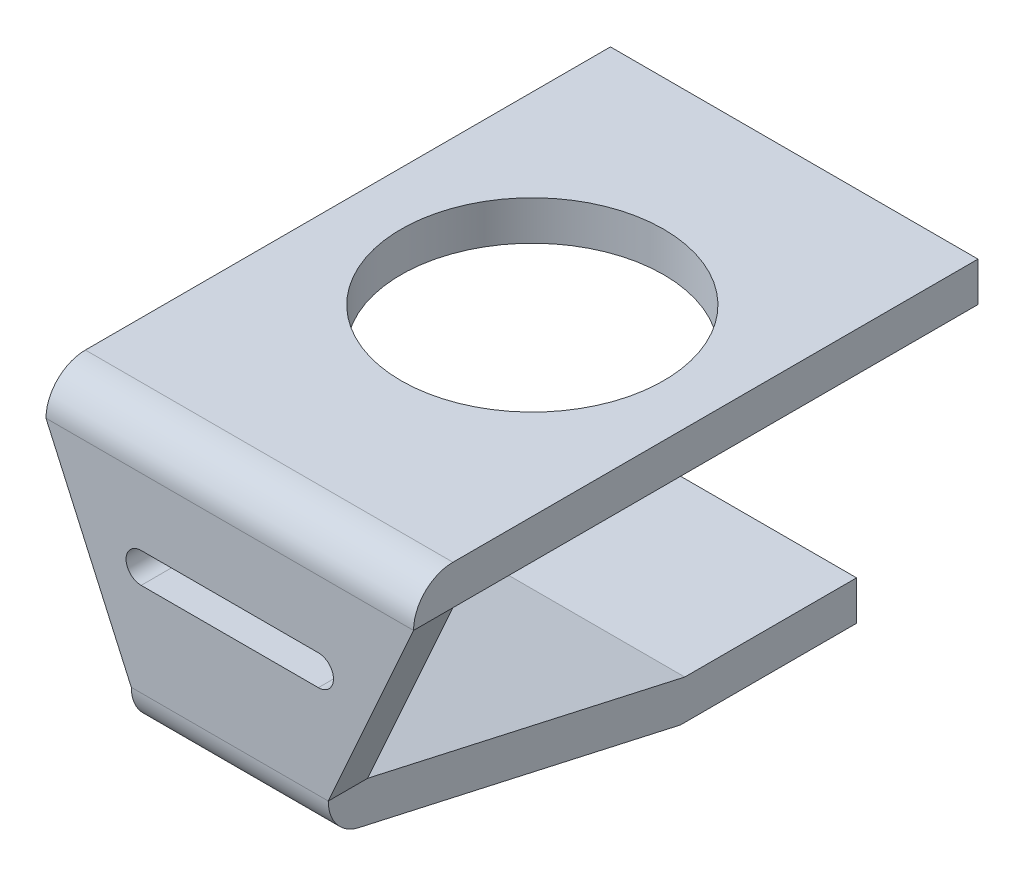
ISO-10303-21;
HEADER;
FILE_DESCRIPTION(('STEP AP214'),'2;1');
FILE_NAME('part.step','',(''),(''),'','','');
FILE_SCHEMA(('AUTOMOTIVE_DESIGN { 1 0 10303 214 1 1 1 1 }'));
ENDSEC;
DATA;
#1=APPLICATION_CONTEXT('core data for automotive mechanical design processes');
#2=APPLICATION_PROTOCOL_DEFINITION('international standard','automotive_design',2000,#1);
#3=PRODUCT_CONTEXT('',#1,'mechanical');
#4=PRODUCT('Part','Part','',(#3));
#5=PRODUCT_RELATED_PRODUCT_CATEGORY('part','',(#4));
#6=PRODUCT_DEFINITION_FORMATION('','',#4);
#7=PRODUCT_DEFINITION_CONTEXT('part definition',#1,'design');
#8=PRODUCT_DEFINITION('design','',#6,#7);
#9=PRODUCT_DEFINITION_SHAPE('','',#8);
#10=(LENGTH_UNIT() NAMED_UNIT(*) SI_UNIT(.MILLI.,.METRE.));
#11=(NAMED_UNIT(*) PLANE_ANGLE_UNIT() SI_UNIT($,.RADIAN.));
#12=(NAMED_UNIT(*) SI_UNIT($,.STERADIAN.) SOLID_ANGLE_UNIT());
#13=UNCERTAINTY_MEASURE_WITH_UNIT(LENGTH_MEASURE(1.E-05),#10,'distance_accuracy_value','');
#14=(GEOMETRIC_REPRESENTATION_CONTEXT(3) GLOBAL_UNCERTAINTY_ASSIGNED_CONTEXT((#13)) GLOBAL_UNIT_ASSIGNED_CONTEXT((#10,
#11,#12)) REPRESENTATION_CONTEXT('',''));
#15=CARTESIAN_POINT('',(0.,0.,0.));
#16=DIRECTION('',(0.,0.,1.));
#17=DIRECTION('',(1.,0.,0.));
#18=AXIS2_PLACEMENT_3D('',#15,#16,#17);
#19=CARTESIAN_POINT('',(-2.8,-0.15,2.));
#20=DIRECTION('',(0.,0.,-1.));
#21=DIRECTION('',(-1.,0.,0.));
#22=AXIS2_PLACEMENT_3D('',#19,#20,#21);
#23=PLANE('',#22);
#24=CARTESIAN_POINT('',(-2.075,-0.775,2.));
#25=DIRECTION('',(0.,0.,-1.));
#26=DIRECTION('',(-1.,0.,0.));
#27=AXIS2_PLACEMENT_3D('',#24,#25,#26);
#28=CIRCLE('',#27,0.115110676224058);
#29=CARTESIAN_POINT('',(-2.075,-0.890110676224058,2.));
#30=VERTEX_POINT('',#29);
#31=CARTESIAN_POINT('',(-2.075,-0.659889323775942,2.));
#32=VERTEX_POINT('',#31);
#33=EDGE_CURVE('E192',#30,#32,#28,.T.);
#34=ORIENTED_EDGE('',*,*,#33,.F.);
#35=DIRECTION('',(-1.,0.,0.));
#36=VECTOR('',#35,1.);
#37=CARTESIAN_POINT('',(-2.8,-0.890110676224058,2.));
#38=LINE('',#37,#36);
#39=CARTESIAN_POINT('',(-0.724999999999999,-0.890110676224058,2.));
#40=VERTEX_POINT('',#39);
#41=EDGE_CURVE('E185',#40,#30,#38,.T.);
#42=ORIENTED_EDGE('',*,*,#41,.F.);
#43=CARTESIAN_POINT('',(-0.724999999999999,-0.775,2.));
#44=DIRECTION('',(0.,0.,-1.));
#45=DIRECTION('',(-1.,0.,0.));
#46=AXIS2_PLACEMENT_3D('',#43,#44,#45);
#47=CIRCLE('',#46,0.115110676224058);
#48=CARTESIAN_POINT('',(-0.724999999999999,-0.659889323775942,2.));
#49=VERTEX_POINT('',#48);
#50=EDGE_CURVE('E165',#49,#40,#47,.T.);
#51=ORIENTED_EDGE('',*,*,#50,.F.);
#52=DIRECTION('',(1.,0.,0.));
#53=VECTOR('',#52,1.);
#54=CARTESIAN_POINT('',(-2.8,-0.659889323775942,2.));
#55=LINE('',#54,#53);
#56=EDGE_CURVE('E190',#32,#49,#55,.T.);
#57=ORIENTED_EDGE('',*,*,#56,.F.);
#58=EDGE_LOOP('',(#34,#42,#51,#57));
#59=FACE_BOUND('',#58,.T.);
#60=DIRECTION('',(0.408860890126183,0.912596719545509,0.));
#61=VECTOR('',#60,1.);
#62=CARTESIAN_POINT('',(-0.46806823692937,-1.19475029982291,2.));
#63=LINE('',#62,#61);
#64=CARTESIAN_POINT('',(-0.649795639817083,-1.60037440262147,2.));
#65=VERTEX_POINT('',#64);
#66=CARTESIAN_POINT('',(0.,-0.15,2.));
#67=VERTEX_POINT('',#66);
#68=EDGE_CURVE('E210',#65,#67,#63,.T.);
#69=ORIENTED_EDGE('',*,*,#68,.F.);
#70=DIRECTION('',(1.,0.,0.));
#71=VECTOR('',#70,1.);
#72=CARTESIAN_POINT('',(-2.8,-1.60037440262147,2.));
#73=LINE('',#72,#71);
#74=CARTESIAN_POINT('',(-2.15020436018292,-1.60037440262147,2.));
#75=VERTEX_POINT('',#74);
#76=EDGE_CURVE('E273',#75,#65,#73,.T.);
#77=ORIENTED_EDGE('',*,*,#76,.F.);
#78=DIRECTION('',(-0.408860890126184,0.912596719545509,0.));
#79=VECTOR('',#78,1.);
#80=CARTESIAN_POINT('',(-2.8,-0.15,2.));
#81=LINE('',#80,#79);
#82=CARTESIAN_POINT('',(-2.8,-0.15,2.));
#83=VERTEX_POINT('',#82);
#84=EDGE_CURVE('E215',#75,#83,#81,.T.);
#85=ORIENTED_EDGE('',*,*,#84,.T.);
#86=DIRECTION('',(1.,0.,0.));
#87=VECTOR('',#86,1.);
#88=CARTESIAN_POINT('',(-2.8,-0.15,2.));
#89=LINE('',#88,#87);
#90=EDGE_CURVE('E270',#83,#67,#89,.T.);
#91=ORIENTED_EDGE('',*,*,#90,.T.);
#92=EDGE_LOOP('',(#69,#77,#85,#91));
#93=FACE_BOUND('',#92,.T.);
#94=ADVANCED_FACE('F35',(#59,#93),#23,.T.);
#95=CARTESIAN_POINT('',(-2.8,-1.60037440262147,2.));
#96=DIRECTION('',(0.,0.975932649259894,-0.218072153445976));
#97=DIRECTION('',(0.,0.218072153445976,0.975932649259894));
#98=AXIS2_PLACEMENT_3D('',#95,#96,#97);
#99=PLANE('',#98);
#100=DIRECTION('',(0.,0.218072153445976,0.975932649259894));
#101=VECTOR('',#100,1.);
#102=CARTESIAN_POINT('',(-0.650000000000001,-1.60037440262147,2.));
#103=LINE('',#102,#101);
#104=CARTESIAN_POINT('',(-0.65,-2.14029609795219,-0.416297551936367));
#105=VERTEX_POINT('',#104);
#106=CARTESIAN_POINT('',(-0.650000000000001,-1.60083054415283,1.99795864164174));
#107=VERTEX_POINT('',#106);
#108=EDGE_CURVE('E226',#105,#107,#103,.T.);
#109=ORIENTED_EDGE('',*,*,#108,.F.);
#110=DIRECTION('',(1.,0.,0.));
#111=VECTOR('',#110,1.);
#112=CARTESIAN_POINT('',(-2.8,-2.14029609795219,-0.416297551936367));
#113=LINE('',#112,#111);
#114=CARTESIAN_POINT('',(-2.15,-2.14029609795219,-0.416297551936367));
#115=VERTEX_POINT('',#114);
#116=EDGE_CURVE('E276',#115,#105,#113,.T.);
#117=ORIENTED_EDGE('',*,*,#116,.F.);
#118=DIRECTION('',(0.,0.218072153445976,0.975932649259894));
#119=VECTOR('',#118,1.);
#120=CARTESIAN_POINT('',(-2.15,-1.60037440262147,2.));
#121=LINE('',#120,#119);
#122=CARTESIAN_POINT('',(-2.15,-1.60083054415283,1.99795864164174));
#123=VERTEX_POINT('',#122);
#124=EDGE_CURVE('E239',#115,#123,#121,.T.);
#125=ORIENTED_EDGE('',*,*,#124,.T.);
#126=DIRECTION('',(-0.0972375378069759,0.217038753674733,0.971307902080775));
#127=VECTOR('',#126,1.);
#128=CARTESIAN_POINT('',(-2.15634826812223,-1.58666091139252,2.06137163142648));
#129=LINE('',#128,#127);
#130=EDGE_CURVE('E212',#123,#75,#129,.T.);
#131=ORIENTED_EDGE('',*,*,#130,.T.);
#132=ORIENTED_EDGE('',*,*,#76,.T.);
#133=DIRECTION('',(0.0972375378069759,0.217038753674733,0.971307902080775));
#134=VECTOR('',#133,1.);
#135=CARTESIAN_POINT('',(-0.67012612040231,-1.6457529906374,1.79691838264426));
#136=LINE('',#135,#134);
#137=EDGE_CURVE('E206',#107,#65,#136,.T.);
#138=ORIENTED_EDGE('',*,*,#137,.F.);
#139=EDGE_LOOP('',(#109,#117,#125,#131,#132,#138));
#140=FACE_BOUND('',#139,.T.);
#141=ADVANCED_FACE('F351',(#140),#99,.T.);
#142=CARTESIAN_POINT('',(-2.8,-2.14029609795219,-0.416297551936367));
#143=DIRECTION('',(0.,1.,0.));
#144=DIRECTION('',(0.,0.,1.));
#145=AXIS2_PLACEMENT_3D('',#142,#143,#144);
#146=PLANE('',#145);
#147=DIRECTION('',(1.,0.,0.));
#148=VECTOR('',#147,1.);
#149=CARTESIAN_POINT('',(-2.8,-2.14029609795219,-1.72484491531932));
#150=LINE('',#149,#148);
#151=CARTESIAN_POINT('',(-2.15,-2.14029609795219,-1.72484491531932));
#152=VERTEX_POINT('',#151);
#153=CARTESIAN_POINT('',(-0.65,-2.14029609795219,-1.72484491531932));
#154=VERTEX_POINT('',#153);
#155=EDGE_CURVE('E279',#152,#154,#150,.T.);
#156=ORIENTED_EDGE('',*,*,#155,.F.);
#157=DIRECTION('',(0.,0.,1.));
#158=VECTOR('',#157,1.);
#159=CARTESIAN_POINT('',(-2.15,-2.14029609795219,-0.416297551936367));
#160=LINE('',#159,#158);
#161=EDGE_CURVE('E236',#152,#115,#160,.T.);
#162=ORIENTED_EDGE('',*,*,#161,.T.);
#163=ORIENTED_EDGE('',*,*,#116,.T.);
#164=DIRECTION('',(0.,0.,1.));
#165=VECTOR('',#164,1.);
#166=CARTESIAN_POINT('',(-0.65,-2.14029609795219,-0.416297551936367));
#167=LINE('',#166,#165);
#168=EDGE_CURVE('E224',#154,#105,#167,.T.);
#169=ORIENTED_EDGE('',*,*,#168,.F.);
#170=EDGE_LOOP('',(#156,#162,#163,#169));
#171=FACE_BOUND('',#170,.T.);
#172=ADVANCED_FACE('F356',(#171),#146,.T.);
#173=CARTESIAN_POINT('',(-2.8,-2.44029609795219,-1.72484491531932));
#174=DIRECTION('',(0.,0.,-1.));
#175=DIRECTION('',(-1.,0.,0.));
#176=AXIS2_PLACEMENT_3D('',#173,#174,#175);
#177=PLANE('',#176);
#178=DIRECTION('',(1.,0.,0.));
#179=VECTOR('',#178,1.);
#180=CARTESIAN_POINT('',(-2.8,-2.44029609795219,-1.72484491531932));
#181=LINE('',#180,#179);
#182=CARTESIAN_POINT('',(-2.15,-2.44029609795219,-1.72484491531932));
#183=VERTEX_POINT('',#182);
#184=CARTESIAN_POINT('',(-0.65,-2.44029609795219,-1.72484491531932));
#185=VERTEX_POINT('',#184);
#186=EDGE_CURVE('E282',#183,#185,#181,.T.);
#187=ORIENTED_EDGE('',*,*,#186,.F.);
#188=DIRECTION('',(0.,1.,0.));
#189=VECTOR('',#188,1.);
#190=CARTESIAN_POINT('',(-2.15,-2.44029609795219,-1.72484491531932));
#191=LINE('',#190,#189);
#192=EDGE_CURVE('E233',#183,#152,#191,.T.);
#193=ORIENTED_EDGE('',*,*,#192,.T.);
#194=ORIENTED_EDGE('',*,*,#155,.T.);
#195=DIRECTION('',(0.,1.,0.));
#196=VECTOR('',#195,1.);
#197=CARTESIAN_POINT('',(-0.65,-2.44029609795219,-1.72484491531932));
#198=LINE('',#197,#196);
#199=EDGE_CURVE('E222',#185,#154,#198,.T.);
#200=ORIENTED_EDGE('',*,*,#199,.F.);
#201=EDGE_LOOP('',(#187,#193,#194,#200));
#202=FACE_BOUND('',#201,.T.);
#203=ADVANCED_FACE('F361',(#202),#177,.T.);
#204=CARTESIAN_POINT('',(-2.8,-2.44029609795219,-0.383188302965609));
#205=DIRECTION('',(0.,-1.,0.));
#206=DIRECTION('',(0.,0.,-1.));
#207=AXIS2_PLACEMENT_3D('',#204,#205,#206);
#208=PLANE('',#207);
#209=DIRECTION('',(1.,0.,0.));
#210=VECTOR('',#209,1.);
#211=CARTESIAN_POINT('',(-2.8,-2.44029609795219,-0.383188302965609));
#212=LINE('',#211,#210);
#213=CARTESIAN_POINT('',(-2.15,-2.44029609795219,-0.383188302965609));
#214=VERTEX_POINT('',#213);
#215=CARTESIAN_POINT('',(-0.65,-2.44029609795219,-0.383188302965609));
#216=VERTEX_POINT('',#215);
#217=EDGE_CURVE('E285',#214,#216,#212,.T.);
#218=ORIENTED_EDGE('',*,*,#217,.F.);
#219=DIRECTION('',(0.,0.,-1.));
#220=VECTOR('',#219,1.);
#221=CARTESIAN_POINT('',(-2.15,-2.44029609795219,-0.383188302965609));
#222=LINE('',#221,#220);
#223=EDGE_CURVE('E230',#214,#183,#222,.T.);
#224=ORIENTED_EDGE('',*,*,#223,.T.);
#225=ORIENTED_EDGE('',*,*,#186,.T.);
#226=DIRECTION('',(0.,0.,-1.));
#227=VECTOR('',#226,1.);
#228=CARTESIAN_POINT('',(-0.65,-2.44029609795219,-0.383188302965609));
#229=LINE('',#228,#227);
#230=EDGE_CURVE('E220',#216,#185,#229,.T.);
#231=ORIENTED_EDGE('',*,*,#230,.F.);
#232=EDGE_LOOP('',(#218,#224,#225,#231));
#233=FACE_BOUND('',#232,.T.);
#234=ADVANCED_FACE('F363',(#233),#208,.T.);
#235=CARTESIAN_POINT('',(-2.8,-1.84073766349206,2.3));
#236=DIRECTION('',(0.,-0.975932649259892,0.218072153445985));
#237=DIRECTION('',(0.,-0.218072153445985,-0.975932649259892));
#238=AXIS2_PLACEMENT_3D('',#235,#236,#237);
#239=PLANE('',#238);
#240=DIRECTION('',(0.,-0.218072153445985,-0.975932649259892));
#241=VECTOR('',#240,1.);
#242=CARTESIAN_POINT('',(-0.65,-1.84073766349206,2.3));
#243=LINE('',#242,#241);
#244=CARTESIAN_POINT('',(-0.65,-1.89315419739941,2.06542164603379));
#245=VERTEX_POINT('',#244);
#246=EDGE_CURVE('E218',#245,#216,#243,.T.);
#247=ORIENTED_EDGE('',*,*,#246,.F.);
#248=DIRECTION('',(1.,0.,0.));
#249=VECTOR('',#248,1.);
#250=CARTESIAN_POINT('',(-2.8,-1.89315419739941,2.06542164603379));
#251=LINE('',#250,#249);
#252=CARTESIAN_POINT('',(-2.15,-1.89315419739941,2.06542164603379));
#253=VERTEX_POINT('',#252);
#254=EDGE_CURVE('E43',#245,#253,#251,.F.);
#255=ORIENTED_EDGE('',*,*,#254,.T.);
#256=DIRECTION('',(0.,-0.218072153445985,-0.975932649259892));
#257=VECTOR('',#256,1.);
#258=CARTESIAN_POINT('',(-2.15,-1.84073766349206,2.3));
#259=LINE('',#258,#257);
#260=EDGE_CURVE('E228',#253,#214,#259,.T.);
#261=ORIENTED_EDGE('',*,*,#260,.T.);
#262=ORIENTED_EDGE('',*,*,#217,.T.);
#263=EDGE_LOOP('',(#247,#255,#261,#262));
#264=FACE_BOUND('',#263,.T.);
#265=ADVANCED_FACE('F310',(#264),#239,.T.);
#266=CARTESIAN_POINT('',(-2.8,-0.15,2.3));
#267=DIRECTION('',(0.,0.,1.));
#268=DIRECTION('',(1.,0.,0.));
#269=AXIS2_PLACEMENT_3D('',#266,#267,#268);
#270=PLANE('',#269);
#271=CARTESIAN_POINT('',(-2.075,-0.775,2.3));
#272=DIRECTION('',(0.,0.,1.));
#273=DIRECTION('',(1.,0.,0.));
#274=AXIS2_PLACEMENT_3D('',#271,#272,#273);
#275=CIRCLE('',#274,0.115110676224058);
#276=CARTESIAN_POINT('',(-2.075,-0.659889323775942,2.3));
#277=VERTEX_POINT('',#276);
#278=CARTESIAN_POINT('',(-2.075,-0.890110676224058,2.3));
#279=VERTEX_POINT('',#278);
#280=EDGE_CURVE('E58',#277,#279,#275,.T.);
#281=ORIENTED_EDGE('',*,*,#280,.F.);
#282=DIRECTION('',(-1.,0.,0.));
#283=VECTOR('',#282,1.);
#284=CARTESIAN_POINT('',(-2.075,-0.659889323775942,2.3));
#285=LINE('',#284,#283);
#286=CARTESIAN_POINT('',(-0.724999999999999,-0.659889323775942,2.3));
#287=VERTEX_POINT('',#286);
#288=EDGE_CURVE('E178',#287,#277,#285,.T.);
#289=ORIENTED_EDGE('',*,*,#288,.F.);
#290=CARTESIAN_POINT('',(-0.724999999999999,-0.775,2.3));
#291=DIRECTION('',(0.,0.,1.));
#292=DIRECTION('',(1.,0.,0.));
#293=AXIS2_PLACEMENT_3D('',#290,#291,#292);
#294=CIRCLE('',#293,0.115110676224058);
#295=CARTESIAN_POINT('',(-0.724999999999999,-0.890110676224058,2.3));
#296=VERTEX_POINT('',#295);
#297=EDGE_CURVE('E162',#296,#287,#294,.T.);
#298=ORIENTED_EDGE('',*,*,#297,.F.);
#299=DIRECTION('',(1.,0.,0.));
#300=VECTOR('',#299,1.);
#301=CARTESIAN_POINT('',(-2.075,-0.890110676224058,2.3));
#302=LINE('',#301,#300);
#303=EDGE_CURVE('E171',#279,#296,#302,.T.);
#304=ORIENTED_EDGE('',*,*,#303,.F.);
#305=EDGE_LOOP('',(#281,#289,#298,#304));
#306=FACE_BOUND('',#305,.T.);
#307=DIRECTION('',(0.408860890126183,-0.912596719545509,0.));
#308=VECTOR('',#307,1.);
#309=CARTESIAN_POINT('',(-2.38790052913257,-1.06982538394413,2.3));
#310=LINE('',#309,#308);
#311=CARTESIAN_POINT('',(-2.8,-0.15,2.3));
#312=VERTEX_POINT('',#311);
#313=CARTESIAN_POINT('',(-2.15020436018293,-1.60037440262144,2.3));
#314=VERTEX_POINT('',#313);
#315=EDGE_CURVE('E195',#312,#314,#310,.T.);
#316=ORIENTED_EDGE('',*,*,#315,.T.);
#317=DIRECTION('',(1.,0.,0.));
#318=VECTOR('',#317,1.);
#319=CARTESIAN_POINT('',(-2.8,-1.60037440262144,2.3));
#320=LINE('',#319,#318);
#321=CARTESIAN_POINT('',(-0.649795639817071,-1.60037440262144,2.3));
#322=VERTEX_POINT('',#321);
#323=EDGE_CURVE('E302',#314,#322,#320,.T.);
#324=ORIENTED_EDGE('',*,*,#323,.T.);
#325=DIRECTION('',(-0.408860890126183,-0.912596719545509,0.));
#326=VECTOR('',#325,1.);
#327=CARTESIAN_POINT('',(0.0559687660619417,-0.0250750841212162,2.3));
#328=LINE('',#327,#326);
#329=CARTESIAN_POINT('',(0.,-0.15,2.3));
#330=VERTEX_POINT('',#329);
#331=EDGE_CURVE('E199',#330,#322,#328,.T.);
#332=ORIENTED_EDGE('',*,*,#331,.F.);
#333=DIRECTION('',(1.,0.,0.));
#334=VECTOR('',#333,1.);
#335=CARTESIAN_POINT('',(-2.8,-0.15,2.3));
#336=LINE('',#335,#334);
#337=EDGE_CURVE('E298',#330,#312,#336,.F.);
#338=ORIENTED_EDGE('',*,*,#337,.T.);
#339=EDGE_LOOP('',(#316,#324,#332,#338));
#340=FACE_BOUND('',#339,.T.);
#341=ADVANCED_FACE('F175',(#306,#340),#270,.T.);
#342=CARTESIAN_POINT('',(-2.8,0.,0.));
#343=DIRECTION('',(1.,0.,0.));
#344=DIRECTION('',(0.,0.,-1.));
#345=AXIS2_PLACEMENT_3D('',#342,#343,#344);
#346=PLANE('',#345);
#347=DIRECTION('',(0.,0.,-1.));
#348=VECTOR('',#347,1.);
#349=CARTESIAN_POINT('',(-2.8,-0.149999999999999,0.));
#350=LINE('',#349,#348);
#351=EDGE_CURVE('E291',#312,#83,#350,.T.);
#352=ORIENTED_EDGE('',*,*,#351,.F.);
#353=CARTESIAN_POINT('',(-2.8,-0.15,2.));
#354=DIRECTION('',(1.,0.,0.));
#355=DIRECTION('',(0.,0.,-1.));
#356=AXIS2_PLACEMENT_3D('',#353,#354,#355);
#357=CIRCLE('',#356,0.3);
#358=CARTESIAN_POINT('',(-2.8,0.15,2.));
#359=VERTEX_POINT('',#358);
#360=EDGE_CURVE('E300',#312,#359,#357,.F.);
#361=ORIENTED_EDGE('',*,*,#360,.T.);
#362=DIRECTION('',(0.,0.,1.));
#363=VECTOR('',#362,1.);
#364=CARTESIAN_POINT('',(-2.8,0.15,2.3));
#365=LINE('',#364,#363);
#366=CARTESIAN_POINT('',(-2.8,0.15,-2.));
#367=VERTEX_POINT('',#366);
#368=EDGE_CURVE('E252',#367,#359,#365,.T.);
#369=ORIENTED_EDGE('',*,*,#368,.F.);
#370=DIRECTION('',(0.,1.,0.));
#371=VECTOR('',#370,1.);
#372=CARTESIAN_POINT('',(-2.8,0.15,-2.));
#373=LINE('',#372,#371);
#374=CARTESIAN_POINT('',(-2.8,-0.15,-2.));
#375=VERTEX_POINT('',#374);
#376=EDGE_CURVE('E249',#375,#367,#373,.T.);
#377=ORIENTED_EDGE('',*,*,#376,.F.);
#378=DIRECTION('',(0.,0.,-1.));
#379=VECTOR('',#378,1.);
#380=CARTESIAN_POINT('',(-2.8,-0.15,2.));
#381=LINE('',#380,#379);
#382=EDGE_CURVE('E256',#83,#375,#381,.T.);
#383=ORIENTED_EDGE('',*,*,#382,.F.);
#384=EDGE_LOOP('',(#352,#361,#369,#377,#383));
#385=FACE_BOUND('',#384,.T.);
#386=ADVANCED_FACE('F333',(#385),#346,.F.);
#387=CARTESIAN_POINT('',(-2.8,0.15,-2.));
#388=DIRECTION('',(0.,0.,-1.));
#389=DIRECTION('',(-1.,0.,0.));
#390=AXIS2_PLACEMENT_3D('',#387,#388,#389);
#391=PLANE('',#390);
#392=DIRECTION('',(0.,1.,0.));
#393=VECTOR('',#392,1.);
#394=CARTESIAN_POINT('',(0.,0.15,-2.));
#395=LINE('',#394,#393);
#396=CARTESIAN_POINT('',(0.,-0.15,-2.));
#397=VERTEX_POINT('',#396);
#398=CARTESIAN_POINT('',(0.,0.15,-2.));
#399=VERTEX_POINT('',#398);
#400=EDGE_CURVE('E248',#397,#399,#395,.T.);
#401=ORIENTED_EDGE('',*,*,#400,.F.);
#402=DIRECTION('',(1.,0.,0.));
#403=VECTOR('',#402,1.);
#404=CARTESIAN_POINT('',(-2.8,-0.15,-2.));
#405=LINE('',#404,#403);
#406=EDGE_CURVE('E267',#375,#397,#405,.T.);
#407=ORIENTED_EDGE('',*,*,#406,.F.);
#408=ORIENTED_EDGE('',*,*,#376,.T.);
#409=DIRECTION('',(1.,0.,0.));
#410=VECTOR('',#409,1.);
#411=CARTESIAN_POINT('',(-2.8,0.15,-2.));
#412=LINE('',#411,#410);
#413=EDGE_CURVE('E259',#367,#399,#412,.T.);
#414=ORIENTED_EDGE('',*,*,#413,.T.);
#415=EDGE_LOOP('',(#401,#407,#408,#414));
#416=FACE_BOUND('',#415,.T.);
#417=ADVANCED_FACE('F341',(#416),#391,.T.);
#418=CARTESIAN_POINT('',(-2.8,-0.15,2.));
#419=DIRECTION('',(0.,-1.,0.));
#420=DIRECTION('',(0.,0.,-1.));
#421=AXIS2_PLACEMENT_3D('',#418,#419,#420);
#422=PLANE('',#421);
#423=CARTESIAN_POINT('',(-1.395,-0.15,0.));
#424=DIRECTION('',(0.,-1.,0.));
#425=DIRECTION('',(0.,0.,-1.));
#426=AXIS2_PLACEMENT_3D('',#423,#424,#425);
#427=CIRCLE('',#426,1.);
#428=CARTESIAN_POINT('',(-1.395,-0.15,-1.));
#429=VERTEX_POINT('',#428);
#430=EDGE_CURVE('E245',#429,#429,#427,.T.);
#431=ORIENTED_EDGE('',*,*,#430,.F.);
#432=EDGE_LOOP('',(#431));
#433=FACE_BOUND('',#432,.T.);
#434=DIRECTION('',(0.,0.,-1.));
#435=VECTOR('',#434,1.);
#436=CARTESIAN_POINT('',(0.,-0.15,2.));
#437=LINE('',#436,#435);
#438=EDGE_CURVE('E253',#67,#397,#437,.T.);
#439=ORIENTED_EDGE('',*,*,#438,.F.);
#440=ORIENTED_EDGE('',*,*,#90,.F.);
#441=ORIENTED_EDGE('',*,*,#382,.T.);
#442=ORIENTED_EDGE('',*,*,#406,.T.);
#443=EDGE_LOOP('',(#439,#440,#441,#442));
#444=FACE_BOUND('',#443,.T.);
#445=ADVANCED_FACE('F345',(#433,#444),#422,.T.);
#446=CARTESIAN_POINT('',(-2.8,0.15,2.3));
#447=DIRECTION('',(0.,1.,0.));
#448=DIRECTION('',(0.,0.,1.));
#449=AXIS2_PLACEMENT_3D('',#446,#447,#448);
#450=PLANE('',#449);
#451=CARTESIAN_POINT('',(-1.395,0.15,0.));
#452=DIRECTION('',(0.,1.,0.));
#453=DIRECTION('',(0.,0.,1.));
#454=AXIS2_PLACEMENT_3D('',#451,#452,#453);
#455=CIRCLE('',#454,1.);
#456=CARTESIAN_POINT('',(-1.395,0.15,0.999999999999998));
#457=VERTEX_POINT('',#456);
#458=EDGE_CURVE('E242',#457,#457,#455,.T.);
#459=ORIENTED_EDGE('',*,*,#458,.F.);
#460=EDGE_LOOP('',(#459));
#461=FACE_BOUND('',#460,.T.);
#462=ORIENTED_EDGE('',*,*,#368,.T.);
#463=DIRECTION('',(1.,0.,0.));
#464=VECTOR('',#463,1.);
#465=CARTESIAN_POINT('',(-2.8,0.15,2.));
#466=LINE('',#465,#464);
#467=CARTESIAN_POINT('',(0.,0.15,2.));
#468=VERTEX_POINT('',#467);
#469=EDGE_CURVE('E293',#359,#468,#466,.T.);
#470=ORIENTED_EDGE('',*,*,#469,.T.);
#471=DIRECTION('',(0.,0.,1.));
#472=VECTOR('',#471,1.);
#473=CARTESIAN_POINT('',(0.,0.15,2.3));
#474=LINE('',#473,#472);
#475=EDGE_CURVE('E262',#399,#468,#474,.T.);
#476=ORIENTED_EDGE('',*,*,#475,.F.);
#477=ORIENTED_EDGE('',*,*,#413,.F.);
#478=EDGE_LOOP('',(#462,#470,#476,#477));
#479=FACE_BOUND('',#478,.T.);
#480=ADVANCED_FACE('F337',(#461,#479),#450,.T.);
#481=CARTESIAN_POINT('',(0.,0.,0.));
#482=DIRECTION('',(1.,0.,0.));
#483=DIRECTION('',(0.,0.,-1.));
#484=AXIS2_PLACEMENT_3D('',#481,#482,#483);
#485=PLANE('',#484);
#486=ORIENTED_EDGE('',*,*,#475,.T.);
#487=CARTESIAN_POINT('',(0.,-0.15,2.));
#488=DIRECTION('',(1.,0.,0.));
#489=DIRECTION('',(0.,0.,-1.));
#490=AXIS2_PLACEMENT_3D('',#487,#488,#489);
#491=CIRCLE('',#490,0.3);
#492=EDGE_CURVE('E296',#468,#330,#491,.T.);
#493=ORIENTED_EDGE('',*,*,#492,.T.);
#494=DIRECTION('',(0.,0.,1.));
#495=VECTOR('',#494,1.);
#496=CARTESIAN_POINT('',(0.,-0.15,0.));
#497=LINE('',#496,#495);
#498=EDGE_CURVE('E269',#67,#330,#497,.T.);
#499=ORIENTED_EDGE('',*,*,#498,.F.);
#500=ORIENTED_EDGE('',*,*,#438,.T.);
#501=ORIENTED_EDGE('',*,*,#400,.T.);
#502=EDGE_LOOP('',(#486,#493,#499,#500,#501));
#503=FACE_BOUND('',#502,.T.);
#504=ADVANCED_FACE('F372',(#503),#485,.T.);
#505=CARTESIAN_POINT('',(-1.395,-0.2,0.));
#506=DIRECTION('',(0.,1.,0.));
#507=DIRECTION('',(0.,0.,1.));
#508=AXIS2_PLACEMENT_3D('',#505,#506,#507);
#509=CYLINDRICAL_SURFACE('',#508,1.);
#510=ORIENTED_EDGE('',*,*,#430,.T.);
#511=EDGE_LOOP('',(#510));
#512=FACE_BOUND('',#511,.T.);
#513=ORIENTED_EDGE('',*,*,#458,.T.);
#514=EDGE_LOOP('',(#513));
#515=FACE_BOUND('',#514,.T.);
#516=ADVANCED_FACE('F374',(#512,#515),#509,.F.);
#517=CARTESIAN_POINT('',(0.0559687660619417,-0.0250750841212162,-3.54));
#518=DIRECTION('',(-0.912596719545509,0.408860890126183,0.));
#519=DIRECTION('',(-0.408860890126183,-0.912596719545509,0.));
#520=AXIS2_PLACEMENT_3D('',#517,#518,#519);
#521=PLANE('',#520);
#522=ORIENTED_EDGE('',*,*,#68,.T.);
#523=ORIENTED_EDGE('',*,*,#498,.T.);
#524=ORIENTED_EDGE('',*,*,#331,.T.);
#525=CARTESIAN_POINT('',(-0.65,-1.60083054415283,2.3));
#526=VERTEX_POINT('',#525);
#527=EDGE_CURVE('E198',#322,#526,#328,.T.);
#528=ORIENTED_EDGE('',*,*,#527,.T.);
#529=DIRECTION('',(0.,0.,1.));
#530=VECTOR('',#529,1.);
#531=CARTESIAN_POINT('',(-0.65,-1.60083054415283,-3.54));
#532=LINE('',#531,#530);
#533=EDGE_CURVE('E203',#107,#526,#532,.T.);
#534=ORIENTED_EDGE('',*,*,#533,.F.);
#535=ORIENTED_EDGE('',*,*,#137,.T.);
#536=EDGE_LOOP('',(#522,#523,#524,#528,#534,#535));
#537=FACE_BOUND('',#536,.T.);
#538=ADVANCED_FACE('F369',(#537),#521,.F.);
#539=CARTESIAN_POINT('',(-0.650000000000002,0.,-3.54));
#540=DIRECTION('',(-1.,0.,0.));
#541=DIRECTION('',(0.,-1.,0.));
#542=AXIS2_PLACEMENT_3D('',#539,#540,#541);
#543=PLANE('',#542);
#544=ORIENTED_EDGE('',*,*,#533,.T.);
#545=CARTESIAN_POINT('',(-0.650000000000001,-1.60037440262144,2.));
#546=DIRECTION('',(-1.,0.,0.));
#547=DIRECTION('',(0.,-1.,0.));
#548=AXIS2_PLACEMENT_3D('',#545,#546,#547);
#549=CIRCLE('',#548,0.3);
#550=EDGE_CURVE('E305',#526,#245,#549,.F.);
#551=ORIENTED_EDGE('',*,*,#550,.T.);
#552=ORIENTED_EDGE('',*,*,#246,.T.);
#553=ORIENTED_EDGE('',*,*,#230,.T.);
#554=ORIENTED_EDGE('',*,*,#199,.T.);
#555=ORIENTED_EDGE('',*,*,#168,.T.);
#556=ORIENTED_EDGE('',*,*,#108,.T.);
#557=EDGE_LOOP('',(#544,#551,#552,#553,#554,#555,#556));
#558=FACE_BOUND('',#557,.T.);
#559=ADVANCED_FACE('F366',(#558),#543,.F.);
#560=CARTESIAN_POINT('',(-2.15,0.,-3.54));
#561=DIRECTION('',(-1.,0.,0.));
#562=DIRECTION('',(0.,-1.,0.));
#563=AXIS2_PLACEMENT_3D('',#560,#561,#562);
#564=PLANE('',#563);
#565=ORIENTED_EDGE('',*,*,#260,.F.);
#566=CARTESIAN_POINT('',(-2.15,-1.60037440262144,2.));
#567=DIRECTION('',(-1.,0.,0.));
#568=DIRECTION('',(0.,-1.,0.));
#569=AXIS2_PLACEMENT_3D('',#566,#567,#568);
#570=CIRCLE('',#569,0.3);
#571=CARTESIAN_POINT('',(-2.15,-1.60083054415283,2.3));
#572=VERTEX_POINT('',#571);
#573=EDGE_CURVE('E11',#253,#572,#570,.T.);
#574=ORIENTED_EDGE('',*,*,#573,.T.);
#575=DIRECTION('',(0.,0.,1.));
#576=VECTOR('',#575,1.);
#577=CARTESIAN_POINT('',(-2.15,-1.60083054415283,-3.54));
#578=LINE('',#577,#576);
#579=EDGE_CURVE('E202',#123,#572,#578,.T.);
#580=ORIENTED_EDGE('',*,*,#579,.F.);
#581=ORIENTED_EDGE('',*,*,#124,.F.);
#582=ORIENTED_EDGE('',*,*,#161,.F.);
#583=ORIENTED_EDGE('',*,*,#192,.F.);
#584=ORIENTED_EDGE('',*,*,#223,.F.);
#585=EDGE_LOOP('',(#565,#574,#580,#581,#582,#583,#584));
#586=FACE_BOUND('',#585,.T.);
#587=ADVANCED_FACE('F316',(#586),#564,.T.);
#588=CARTESIAN_POINT('',(-2.38790052913257,-1.06982538394413,-3.54));
#589=DIRECTION('',(-0.912596719545509,-0.408860890126184,0.));
#590=DIRECTION('',(0.408860890126184,-0.912596719545509,0.));
#591=AXIS2_PLACEMENT_3D('',#588,#589,#590);
#592=PLANE('',#591);
#593=ORIENTED_EDGE('',*,*,#130,.F.);
#594=ORIENTED_EDGE('',*,*,#579,.T.);
#595=EDGE_CURVE('E194',#314,#572,#310,.T.);
#596=ORIENTED_EDGE('',*,*,#595,.F.);
#597=ORIENTED_EDGE('',*,*,#315,.F.);
#598=ORIENTED_EDGE('',*,*,#351,.T.);
#599=ORIENTED_EDGE('',*,*,#84,.F.);
#600=EDGE_LOOP('',(#593,#594,#596,#597,#598,#599));
#601=FACE_BOUND('',#600,.T.);
#602=ADVANCED_FACE('F323',(#601),#592,.T.);
#603=CARTESIAN_POINT('',(-2.8,-0.15,2.));
#604=DIRECTION('',(1.,0.,0.));
#605=DIRECTION('',(0.,0.,-1.));
#606=AXIS2_PLACEMENT_3D('',#603,#604,#605);
#607=CYLINDRICAL_SURFACE('',#606,0.3);
#608=ORIENTED_EDGE('',*,*,#360,.F.);
#609=ORIENTED_EDGE('',*,*,#337,.F.);
#610=ORIENTED_EDGE('',*,*,#492,.F.);
#611=ORIENTED_EDGE('',*,*,#469,.F.);
#612=EDGE_LOOP('',(#608,#609,#610,#611));
#613=FACE_BOUND('',#612,.T.);
#614=ADVANCED_FACE('F329',(#613),#607,.T.);
#615=CARTESIAN_POINT('',(-2.8,-1.60037440262144,2.));
#616=DIRECTION('',(1.,0.,0.));
#617=DIRECTION('',(0.,0.,-1.));
#618=AXIS2_PLACEMENT_3D('',#615,#616,#617);
#619=CYLINDRICAL_SURFACE('',#618,0.3);
#620=ORIENTED_EDGE('',*,*,#573,.F.);
#621=ORIENTED_EDGE('',*,*,#254,.F.);
#622=ORIENTED_EDGE('',*,*,#550,.F.);
#623=ORIENTED_EDGE('',*,*,#527,.F.);
#624=ORIENTED_EDGE('',*,*,#323,.F.);
#625=ORIENTED_EDGE('',*,*,#595,.T.);
#626=EDGE_LOOP('',(#620,#621,#622,#623,#624,#625));
#627=FACE_BOUND('',#626,.T.);
#628=ADVANCED_FACE('F37',(#627),#619,.T.);
#629=CARTESIAN_POINT('',(-2.075,-0.775,1.92));
#630=DIRECTION('',(0.,0.,1.));
#631=DIRECTION('',(1.,0.,0.));
#632=AXIS2_PLACEMENT_3D('',#629,#630,#631);
#633=CYLINDRICAL_SURFACE('',#632,0.115110676224058);
#634=ORIENTED_EDGE('',*,*,#33,.T.);
#635=DIRECTION('',(0.,0.,1.));
#636=VECTOR('',#635,1.);
#637=CARTESIAN_POINT('',(-2.075,-0.659889323775942,1.92));
#638=LINE('',#637,#636);
#639=EDGE_CURVE('E183',#32,#277,#638,.T.);
#640=ORIENTED_EDGE('',*,*,#639,.T.);
#641=ORIENTED_EDGE('',*,*,#280,.T.);
#642=DIRECTION('',(0.,0.,1.));
#643=VECTOR('',#642,1.);
#644=CARTESIAN_POINT('',(-2.075,-0.890110676224058,1.92));
#645=LINE('',#644,#643);
#646=EDGE_CURVE('E168',#30,#279,#645,.T.);
#647=ORIENTED_EDGE('',*,*,#646,.F.);
#648=EDGE_LOOP('',(#634,#640,#641,#647));
#649=FACE_BOUND('',#648,.T.);
#650=ADVANCED_FACE('F411',(#649),#633,.F.);
#651=CARTESIAN_POINT('',(-2.075,-0.659889323775942,1.92));
#652=DIRECTION('',(0.,1.,0.));
#653=DIRECTION('',(-1.,0.,0.));
#654=AXIS2_PLACEMENT_3D('',#651,#652,#653);
#655=PLANE('',#654);
#656=ORIENTED_EDGE('',*,*,#56,.T.);
#657=DIRECTION('',(0.,0.,1.));
#658=VECTOR('',#657,1.);
#659=CARTESIAN_POINT('',(-0.724999999999999,-0.659889323775942,1.92));
#660=LINE('',#659,#658);
#661=EDGE_CURVE('E167',#49,#287,#660,.T.);
#662=ORIENTED_EDGE('',*,*,#661,.T.);
#663=ORIENTED_EDGE('',*,*,#288,.T.);
#664=ORIENTED_EDGE('',*,*,#639,.F.);
#665=EDGE_LOOP('',(#656,#662,#663,#664));
#666=FACE_BOUND('',#665,.T.);
#667=ADVANCED_FACE('F507',(#666),#655,.F.);
#668=CARTESIAN_POINT('',(-0.724999999999999,-0.775,1.92));
#669=DIRECTION('',(0.,0.,1.));
#670=DIRECTION('',(1.,0.,0.));
#671=AXIS2_PLACEMENT_3D('',#668,#669,#670);
#672=CYLINDRICAL_SURFACE('',#671,0.115110676224058);
#673=ORIENTED_EDGE('',*,*,#50,.T.);
#674=DIRECTION('',(0.,0.,1.));
#675=VECTOR('',#674,1.);
#676=CARTESIAN_POINT('',(-0.724999999999999,-0.890110676224058,1.92));
#677=LINE('',#676,#675);
#678=EDGE_CURVE('E50',#40,#296,#677,.T.);
#679=ORIENTED_EDGE('',*,*,#678,.T.);
#680=ORIENTED_EDGE('',*,*,#297,.T.);
#681=ORIENTED_EDGE('',*,*,#661,.F.);
#682=EDGE_LOOP('',(#673,#679,#680,#681));
#683=FACE_BOUND('',#682,.T.);
#684=ADVANCED_FACE('F159',(#683),#672,.F.);
#685=CARTESIAN_POINT('',(-2.075,-0.890110676224058,1.92));
#686=DIRECTION('',(0.,-1.,0.));
#687=DIRECTION('',(1.,0.,0.));
#688=AXIS2_PLACEMENT_3D('',#685,#686,#687);
#689=PLANE('',#688);
#690=ORIENTED_EDGE('',*,*,#41,.T.);
#691=ORIENTED_EDGE('',*,*,#646,.T.);
#692=ORIENTED_EDGE('',*,*,#303,.T.);
#693=ORIENTED_EDGE('',*,*,#678,.F.);
#694=EDGE_LOOP('',(#690,#691,#692,#693));
#695=FACE_BOUND('',#694,.T.);
#696=ADVANCED_FACE('F172',(#695),#689,.F.);
#697=CLOSED_SHELL('',(#94,#141,#172,#203,#234,#265,#341,#386,#417,#445,#480,#504,#516,#538,#559,
#587,#602,#614,#628,#650,#667,#684,#696));
#698=MANIFOLD_SOLID_BREP('B2',#697);
#699=ADVANCED_BREP_SHAPE_REPRESENTATION('',(#18,#698),#14);
#700=SHAPE_DEFINITION_REPRESENTATION(#9,#699);
ENDSEC;
END-ISO-10303-21;
